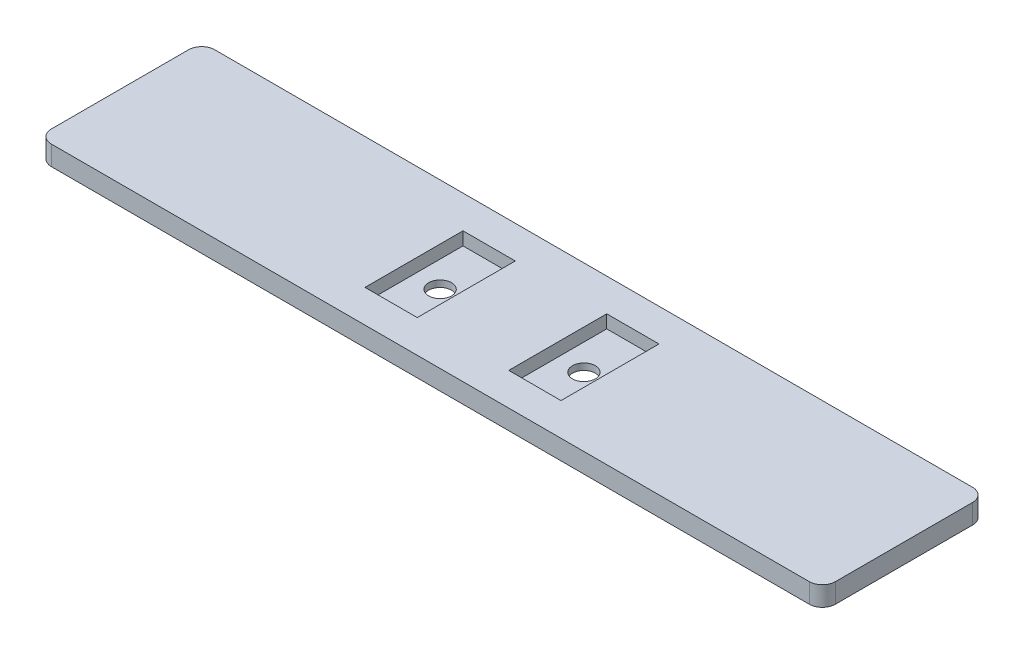
ISO-10303-21;
HEADER;
FILE_DESCRIPTION(('STEP AP214'),'2;1');
FILE_NAME('part.step','',(''),(''),'','','');
FILE_SCHEMA(('AUTOMOTIVE_DESIGN { 1 0 10303 214 1 1 1 1 }'));
ENDSEC;
DATA;
#1=APPLICATION_CONTEXT('core data for automotive mechanical design processes');
#2=APPLICATION_PROTOCOL_DEFINITION('international standard','automotive_design',2000,#1);
#3=PRODUCT_CONTEXT('',#1,'mechanical');
#4=PRODUCT('Part','Part','',(#3));
#5=PRODUCT_RELATED_PRODUCT_CATEGORY('part','',(#4));
#6=PRODUCT_DEFINITION_FORMATION('','',#4);
#7=PRODUCT_DEFINITION_CONTEXT('part definition',#1,'design');
#8=PRODUCT_DEFINITION('design','',#6,#7);
#9=PRODUCT_DEFINITION_SHAPE('','',#8);
#10=(LENGTH_UNIT() NAMED_UNIT(*) SI_UNIT(.MILLI.,.METRE.));
#11=(NAMED_UNIT(*) PLANE_ANGLE_UNIT() SI_UNIT($,.RADIAN.));
#12=(NAMED_UNIT(*) SI_UNIT($,.STERADIAN.) SOLID_ANGLE_UNIT());
#13=UNCERTAINTY_MEASURE_WITH_UNIT(LENGTH_MEASURE(1.E-05),#10,'distance_accuracy_value','');
#14=(GEOMETRIC_REPRESENTATION_CONTEXT(3) GLOBAL_UNCERTAINTY_ASSIGNED_CONTEXT((#13)) GLOBAL_UNIT_ASSIGNED_CONTEXT((#10,
#11,#12)) REPRESENTATION_CONTEXT('',''));
#15=CARTESIAN_POINT('',(0.,0.,0.));
#16=DIRECTION('',(0.,0.,1.));
#17=DIRECTION('',(1.,0.,0.));
#18=AXIS2_PLACEMENT_3D('',#15,#16,#17);
#19=CARTESIAN_POINT('',(-58.,3.,-10.5));
#20=DIRECTION('',(0.,1.,0.));
#21=DIRECTION('',(0.,0.,1.));
#22=AXIS2_PLACEMENT_3D('',#19,#20,#21);
#23=CYLINDRICAL_SURFACE('',#22,2.);
#24=DIRECTION('',(0.,1.,0.));
#25=VECTOR('',#24,1.);
#26=CARTESIAN_POINT('',(-58.,3.,-12.5));
#27=LINE('',#26,#25);
#28=CARTESIAN_POINT('',(-58.,0.,-12.5));
#29=VERTEX_POINT('',#28);
#30=CARTESIAN_POINT('',(-58.,3.,-12.5));
#31=VERTEX_POINT('',#30);
#32=EDGE_CURVE('E278',#29,#31,#27,.T.);
#33=ORIENTED_EDGE('',*,*,#32,.F.);
#34=CARTESIAN_POINT('',(-58.,0.,-10.5));
#35=DIRECTION('',(0.,1.,0.));
#36=DIRECTION('',(0.,0.,1.));
#37=AXIS2_PLACEMENT_3D('',#34,#35,#36);
#38=CIRCLE('',#37,2.);
#39=CARTESIAN_POINT('',(-60.,0.,-10.5));
#40=VERTEX_POINT('',#39);
#41=EDGE_CURVE('E40',#40,#29,#38,.F.);
#42=ORIENTED_EDGE('',*,*,#41,.F.);
#43=DIRECTION('',(0.,1.,0.));
#44=VECTOR('',#43,1.);
#45=CARTESIAN_POINT('',(-60.,3.,-10.5));
#46=LINE('',#45,#44);
#47=CARTESIAN_POINT('',(-60.,3.,-10.5));
#48=VERTEX_POINT('',#47);
#49=EDGE_CURVE('E281',#48,#40,#46,.F.);
#50=ORIENTED_EDGE('',*,*,#49,.F.);
#51=CARTESIAN_POINT('',(-58.,3.,-10.5));
#52=DIRECTION('',(0.,1.,0.));
#53=DIRECTION('',(0.,0.,1.));
#54=AXIS2_PLACEMENT_3D('',#51,#52,#53);
#55=CIRCLE('',#54,2.);
#56=EDGE_CURVE('E11',#31,#48,#55,.T.);
#57=ORIENTED_EDGE('',*,*,#56,.F.);
#58=EDGE_LOOP('',(#33,#42,#50,#57));
#59=FACE_BOUND('',#58,.T.);
#60=ADVANCED_FACE('F33',(#59),#23,.T.);
#61=CARTESIAN_POINT('',(58.,3.,-10.5));
#62=DIRECTION('',(0.,1.,0.));
#63=DIRECTION('',(0.,0.,1.));
#64=AXIS2_PLACEMENT_3D('',#61,#62,#63);
#65=CYLINDRICAL_SURFACE('',#64,2.);
#66=DIRECTION('',(0.,1.,0.));
#67=VECTOR('',#66,1.);
#68=CARTESIAN_POINT('',(60.,3.,-10.5));
#69=LINE('',#68,#67);
#70=CARTESIAN_POINT('',(60.,0.,-10.5));
#71=VERTEX_POINT('',#70);
#72=CARTESIAN_POINT('',(60.,3.,-10.5));
#73=VERTEX_POINT('',#72);
#74=EDGE_CURVE('E268',#71,#73,#69,.T.);
#75=ORIENTED_EDGE('',*,*,#74,.F.);
#76=CARTESIAN_POINT('',(58.,0.,-10.5));
#77=DIRECTION('',(0.,1.,0.));
#78=DIRECTION('',(0.,0.,1.));
#79=AXIS2_PLACEMENT_3D('',#76,#77,#78);
#80=CIRCLE('',#79,2.);
#81=CARTESIAN_POINT('',(58.,0.,-12.5));
#82=VERTEX_POINT('',#81);
#83=EDGE_CURVE('E274',#82,#71,#80,.F.);
#84=ORIENTED_EDGE('',*,*,#83,.F.);
#85=DIRECTION('',(0.,1.,0.));
#86=VECTOR('',#85,1.);
#87=CARTESIAN_POINT('',(58.,3.,-12.5));
#88=LINE('',#87,#86);
#89=CARTESIAN_POINT('',(58.,3.,-12.5));
#90=VERTEX_POINT('',#89);
#91=EDGE_CURVE('E271',#90,#82,#88,.F.);
#92=ORIENTED_EDGE('',*,*,#91,.F.);
#93=CARTESIAN_POINT('',(58.,3.,-10.5));
#94=DIRECTION('',(0.,1.,0.));
#95=DIRECTION('',(0.,0.,1.));
#96=AXIS2_PLACEMENT_3D('',#93,#94,#95);
#97=CIRCLE('',#96,2.);
#98=EDGE_CURVE('E276',#73,#90,#97,.T.);
#99=ORIENTED_EDGE('',*,*,#98,.F.);
#100=EDGE_LOOP('',(#75,#84,#92,#99));
#101=FACE_BOUND('',#100,.T.);
#102=ADVANCED_FACE('F292',(#101),#65,.T.);
#103=CARTESIAN_POINT('',(58.,3.,10.5));
#104=DIRECTION('',(0.,1.,0.));
#105=DIRECTION('',(0.,0.,1.));
#106=AXIS2_PLACEMENT_3D('',#103,#104,#105);
#107=CYLINDRICAL_SURFACE('',#106,2.);
#108=DIRECTION('',(0.,1.,0.));
#109=VECTOR('',#108,1.);
#110=CARTESIAN_POINT('',(58.,3.,12.5));
#111=LINE('',#110,#109);
#112=CARTESIAN_POINT('',(58.,0.,12.5));
#113=VERTEX_POINT('',#112);
#114=CARTESIAN_POINT('',(58.,3.,12.5));
#115=VERTEX_POINT('',#114);
#116=EDGE_CURVE('E258',#113,#115,#111,.T.);
#117=ORIENTED_EDGE('',*,*,#116,.F.);
#118=CARTESIAN_POINT('',(58.,0.,10.5));
#119=DIRECTION('',(0.,1.,0.));
#120=DIRECTION('',(0.,0.,1.));
#121=AXIS2_PLACEMENT_3D('',#118,#119,#120);
#122=CIRCLE('',#121,2.);
#123=CARTESIAN_POINT('',(60.,0.,10.5));
#124=VERTEX_POINT('',#123);
#125=EDGE_CURVE('E264',#124,#113,#122,.F.);
#126=ORIENTED_EDGE('',*,*,#125,.F.);
#127=DIRECTION('',(0.,1.,0.));
#128=VECTOR('',#127,1.);
#129=CARTESIAN_POINT('',(60.,3.,10.5));
#130=LINE('',#129,#128);
#131=CARTESIAN_POINT('',(60.,3.,10.5));
#132=VERTEX_POINT('',#131);
#133=EDGE_CURVE('E261',#132,#124,#130,.F.);
#134=ORIENTED_EDGE('',*,*,#133,.F.);
#135=CARTESIAN_POINT('',(58.,3.,10.5));
#136=DIRECTION('',(0.,1.,0.));
#137=DIRECTION('',(0.,0.,1.));
#138=AXIS2_PLACEMENT_3D('',#135,#136,#137);
#139=CIRCLE('',#138,2.);
#140=EDGE_CURVE('E266',#115,#132,#139,.T.);
#141=ORIENTED_EDGE('',*,*,#140,.F.);
#142=EDGE_LOOP('',(#117,#126,#134,#141));
#143=FACE_BOUND('',#142,.T.);
#144=ADVANCED_FACE('F301',(#143),#107,.T.);
#145=CARTESIAN_POINT('',(-58.,3.,10.5));
#146=DIRECTION('',(0.,1.,0.));
#147=DIRECTION('',(0.,0.,1.));
#148=AXIS2_PLACEMENT_3D('',#145,#146,#147);
#149=CYLINDRICAL_SURFACE('',#148,2.);
#150=DIRECTION('',(0.,1.,0.));
#151=VECTOR('',#150,1.);
#152=CARTESIAN_POINT('',(-60.,3.,10.5));
#153=LINE('',#152,#151);
#154=CARTESIAN_POINT('',(-60.,0.,10.5));
#155=VERTEX_POINT('',#154);
#156=CARTESIAN_POINT('',(-60.,3.,10.5));
#157=VERTEX_POINT('',#156);
#158=EDGE_CURVE('E232',#155,#157,#153,.T.);
#159=ORIENTED_EDGE('',*,*,#158,.F.);
#160=CARTESIAN_POINT('',(-58.,0.,10.5));
#161=DIRECTION('',(0.,1.,0.));
#162=DIRECTION('',(0.,0.,1.));
#163=AXIS2_PLACEMENT_3D('',#160,#161,#162);
#164=CIRCLE('',#163,2.);
#165=CARTESIAN_POINT('',(-58.,0.,12.5));
#166=VERTEX_POINT('',#165);
#167=EDGE_CURVE('E253',#166,#155,#164,.F.);
#168=ORIENTED_EDGE('',*,*,#167,.F.);
#169=DIRECTION('',(0.,1.,0.));
#170=VECTOR('',#169,1.);
#171=CARTESIAN_POINT('',(-58.,3.,12.5));
#172=LINE('',#171,#170);
#173=CARTESIAN_POINT('',(-58.,3.,12.5));
#174=VERTEX_POINT('',#173);
#175=EDGE_CURVE('E250',#174,#166,#172,.F.);
#176=ORIENTED_EDGE('',*,*,#175,.F.);
#177=CARTESIAN_POINT('',(-58.,3.,10.5));
#178=DIRECTION('',(0.,1.,0.));
#179=DIRECTION('',(0.,0.,1.));
#180=AXIS2_PLACEMENT_3D('',#177,#178,#179);
#181=CIRCLE('',#180,2.);
#182=EDGE_CURVE('E256',#157,#174,#181,.T.);
#183=ORIENTED_EDGE('',*,*,#182,.F.);
#184=EDGE_LOOP('',(#159,#168,#176,#183));
#185=FACE_BOUND('',#184,.T.);
#186=ADVANCED_FACE('F309',(#185),#149,.T.);
#187=CARTESIAN_POINT('',(-60.,3.,12.5));
#188=DIRECTION('',(1.,0.,0.));
#189=DIRECTION('',(0.,0.,-1.));
#190=AXIS2_PLACEMENT_3D('',#187,#188,#189);
#191=PLANE('',#190);
#192=DIRECTION('',(0.,0.,1.));
#193=VECTOR('',#192,1.);
#194=CARTESIAN_POINT('',(-60.,3.,12.5));
#195=LINE('',#194,#193);
#196=EDGE_CURVE('E221',#48,#157,#195,.T.);
#197=ORIENTED_EDGE('',*,*,#196,.F.);
#198=ORIENTED_EDGE('',*,*,#49,.T.);
#199=DIRECTION('',(0.,0.,1.));
#200=VECTOR('',#199,1.);
#201=CARTESIAN_POINT('',(-60.,0.,12.5));
#202=LINE('',#201,#200);
#203=EDGE_CURVE('E214',#40,#155,#202,.T.);
#204=ORIENTED_EDGE('',*,*,#203,.T.);
#205=ORIENTED_EDGE('',*,*,#158,.T.);
#206=EDGE_LOOP('',(#197,#198,#204,#205));
#207=FACE_BOUND('',#206,.T.);
#208=ADVANCED_FACE('F312',(#207),#191,.F.);
#209=CARTESIAN_POINT('',(60.,3.,12.5));
#210=DIRECTION('',(0.,0.,-1.));
#211=DIRECTION('',(-1.,0.,0.));
#212=AXIS2_PLACEMENT_3D('',#209,#210,#211);
#213=PLANE('',#212);
#214=DIRECTION('',(1.,0.,0.));
#215=VECTOR('',#214,1.);
#216=CARTESIAN_POINT('',(60.,0.,12.5));
#217=LINE('',#216,#215);
#218=EDGE_CURVE('E234',#166,#113,#217,.T.);
#219=ORIENTED_EDGE('',*,*,#218,.T.);
#220=ORIENTED_EDGE('',*,*,#116,.T.);
#221=DIRECTION('',(1.,0.,0.));
#222=VECTOR('',#221,1.);
#223=CARTESIAN_POINT('',(60.,3.,12.5));
#224=LINE('',#223,#222);
#225=EDGE_CURVE('E223',#174,#115,#224,.T.);
#226=ORIENTED_EDGE('',*,*,#225,.F.);
#227=ORIENTED_EDGE('',*,*,#175,.T.);
#228=EDGE_LOOP('',(#219,#220,#226,#227));
#229=FACE_BOUND('',#228,.T.);
#230=ADVANCED_FACE('F304',(#229),#213,.F.);
#231=CARTESIAN_POINT('',(60.,3.,12.5));
#232=DIRECTION('',(-1.,0.,0.));
#233=DIRECTION('',(0.,0.,1.));
#234=AXIS2_PLACEMENT_3D('',#231,#232,#233);
#235=PLANE('',#234);
#236=DIRECTION('',(0.,0.,-1.));
#237=VECTOR('',#236,1.);
#238=CARTESIAN_POINT('',(60.,0.,12.5));
#239=LINE('',#238,#237);
#240=EDGE_CURVE('E237',#124,#71,#239,.T.);
#241=ORIENTED_EDGE('',*,*,#240,.T.);
#242=ORIENTED_EDGE('',*,*,#74,.T.);
#243=DIRECTION('',(0.,0.,-1.));
#244=VECTOR('',#243,1.);
#245=CARTESIAN_POINT('',(60.,3.,12.5));
#246=LINE('',#245,#244);
#247=EDGE_CURVE('E227',#132,#73,#246,.T.);
#248=ORIENTED_EDGE('',*,*,#247,.F.);
#249=ORIENTED_EDGE('',*,*,#133,.T.);
#250=EDGE_LOOP('',(#241,#242,#248,#249));
#251=FACE_BOUND('',#250,.T.);
#252=ADVANCED_FACE('F297',(#251),#235,.F.);
#253=CARTESIAN_POINT('',(60.,3.,-12.5));
#254=DIRECTION('',(0.,0.,1.));
#255=DIRECTION('',(1.,0.,0.));
#256=AXIS2_PLACEMENT_3D('',#253,#254,#255);
#257=PLANE('',#256);
#258=DIRECTION('',(-1.,0.,0.));
#259=VECTOR('',#258,1.);
#260=CARTESIAN_POINT('',(60.,0.,-12.5));
#261=LINE('',#260,#259);
#262=EDGE_CURVE('E224',#82,#29,#261,.T.);
#263=ORIENTED_EDGE('',*,*,#262,.T.);
#264=ORIENTED_EDGE('',*,*,#32,.T.);
#265=DIRECTION('',(-1.,0.,0.));
#266=VECTOR('',#265,1.);
#267=CARTESIAN_POINT('',(60.,3.,-12.5));
#268=LINE('',#267,#266);
#269=EDGE_CURVE('E230',#90,#31,#268,.T.);
#270=ORIENTED_EDGE('',*,*,#269,.F.);
#271=ORIENTED_EDGE('',*,*,#91,.T.);
#272=EDGE_LOOP('',(#263,#264,#270,#271));
#273=FACE_BOUND('',#272,.T.);
#274=ADVANCED_FACE('F288',(#273),#257,.F.);
#275=CARTESIAN_POINT('',(0.,3.,0.));
#276=DIRECTION('',(0.,1.,0.));
#277=DIRECTION('',(0.,0.,1.));
#278=AXIS2_PLACEMENT_3D('',#275,#276,#277);
#279=PLANE('',#278);
#280=DIRECTION('',(0.,0.,-1.));
#281=VECTOR('',#280,1.);
#282=CARTESIAN_POINT('',(15.0000000000001,3.,-7.49999999999993));
#283=LINE('',#282,#281);
#284=CARTESIAN_POINT('',(15.,3.,7.50000000000007));
#285=VERTEX_POINT('',#284);
#286=CARTESIAN_POINT('',(15.0000000000001,3.,-7.49999999999993));
#287=VERTEX_POINT('',#286);
#288=EDGE_CURVE('E149',#285,#287,#283,.T.);
#289=ORIENTED_EDGE('',*,*,#288,.F.);
#290=DIRECTION('',(1.,0.,0.));
#291=VECTOR('',#290,1.);
#292=CARTESIAN_POINT('',(15.,3.,7.50000000000007));
#293=LINE('',#292,#291);
#294=CARTESIAN_POINT('',(6.99999999999999,3.,7.50000000000003));
#295=VERTEX_POINT('',#294);
#296=EDGE_CURVE('E166',#295,#285,#293,.T.);
#297=ORIENTED_EDGE('',*,*,#296,.F.);
#298=DIRECTION('',(0.,0.,1.));
#299=VECTOR('',#298,1.);
#300=CARTESIAN_POINT('',(7.00000000000007,3.,-7.49999999999997));
#301=LINE('',#300,#299);
#302=CARTESIAN_POINT('',(7.00000000000007,3.,-7.49999999999997));
#303=VERTEX_POINT('',#302);
#304=EDGE_CURVE('E169',#303,#295,#301,.T.);
#305=ORIENTED_EDGE('',*,*,#304,.F.);
#306=DIRECTION('',(-1.,0.,0.));
#307=VECTOR('',#306,1.);
#308=CARTESIAN_POINT('',(15.0000000000001,3.,-7.49999999999993));
#309=LINE('',#308,#307);
#310=EDGE_CURVE('E178',#287,#303,#309,.T.);
#311=ORIENTED_EDGE('',*,*,#310,.F.);
#312=EDGE_LOOP('',(#289,#297,#305,#311));
#313=FACE_BOUND('',#312,.T.);
#314=DIRECTION('',(0.,0.,-1.));
#315=VECTOR('',#314,1.);
#316=CARTESIAN_POINT('',(-7.,3.,-7.5));
#317=LINE('',#316,#315);
#318=CARTESIAN_POINT('',(-7.,3.,7.5));
#319=VERTEX_POINT('',#318);
#320=CARTESIAN_POINT('',(-7.,3.,-7.5));
#321=VERTEX_POINT('',#320);
#322=EDGE_CURVE('E185',#319,#321,#317,.T.);
#323=ORIENTED_EDGE('',*,*,#322,.F.);
#324=DIRECTION('',(1.,0.,0.));
#325=VECTOR('',#324,1.);
#326=CARTESIAN_POINT('',(-15.,3.,7.5));
#327=LINE('',#326,#325);
#328=CARTESIAN_POINT('',(-15.,3.,7.5));
#329=VERTEX_POINT('',#328);
#330=EDGE_CURVE('E193',#329,#319,#327,.T.);
#331=ORIENTED_EDGE('',*,*,#330,.F.);
#332=DIRECTION('',(0.,0.,1.));
#333=VECTOR('',#332,1.);
#334=CARTESIAN_POINT('',(-15.,3.,-7.5));
#335=LINE('',#334,#333);
#336=CARTESIAN_POINT('',(-15.,3.,-7.5));
#337=VERTEX_POINT('',#336);
#338=EDGE_CURVE('E207',#337,#329,#335,.T.);
#339=ORIENTED_EDGE('',*,*,#338,.F.);
#340=DIRECTION('',(-1.,0.,0.));
#341=VECTOR('',#340,1.);
#342=CARTESIAN_POINT('',(-15.,3.,-7.5));
#343=LINE('',#342,#341);
#344=EDGE_CURVE('E204',#321,#337,#343,.T.);
#345=ORIENTED_EDGE('',*,*,#344,.F.);
#346=EDGE_LOOP('',(#323,#331,#339,#345));
#347=FACE_BOUND('',#346,.T.);
#348=ORIENTED_EDGE('',*,*,#269,.T.);
#349=ORIENTED_EDGE('',*,*,#56,.T.);
#350=ORIENTED_EDGE('',*,*,#196,.T.);
#351=ORIENTED_EDGE('',*,*,#182,.T.);
#352=ORIENTED_EDGE('',*,*,#225,.T.);
#353=ORIENTED_EDGE('',*,*,#140,.T.);
#354=ORIENTED_EDGE('',*,*,#247,.T.);
#355=ORIENTED_EDGE('',*,*,#98,.T.);
#356=EDGE_LOOP('',(#348,#349,#350,#351,#352,#353,#354,#355));
#357=FACE_BOUND('',#356,.T.);
#358=ADVANCED_FACE('F313',(#313,#347,#357),#279,.T.);
#359=CARTESIAN_POINT('',(0.,0.,0.));
#360=DIRECTION('',(0.,1.,0.));
#361=DIRECTION('',(0.,0.,1.));
#362=AXIS2_PLACEMENT_3D('',#359,#360,#361);
#363=PLANE('',#362);
#364=CARTESIAN_POINT('',(11.,0.,0.));
#365=DIRECTION('',(0.,1.,0.));
#366=DIRECTION('',(0.,0.,-1.));
#367=AXIS2_PLACEMENT_3D('',#364,#365,#366);
#368=CIRCLE('',#367,1.75);
#369=CARTESIAN_POINT('',(11.,0.,-1.74999999999997));
#370=VERTEX_POINT('',#369);
#371=EDGE_CURVE('E247',#370,#370,#368,.T.);
#372=ORIENTED_EDGE('',*,*,#371,.T.);
#373=EDGE_LOOP('',(#372));
#374=FACE_BOUND('',#373,.T.);
#375=CARTESIAN_POINT('',(-11.,0.,0.));
#376=DIRECTION('',(0.,1.,0.));
#377=DIRECTION('',(0.,0.,1.));
#378=AXIS2_PLACEMENT_3D('',#375,#376,#377);
#379=CIRCLE('',#378,1.75);
#380=CARTESIAN_POINT('',(-11.,0.,1.75));
#381=VERTEX_POINT('',#380);
#382=EDGE_CURVE('E172',#381,#381,#379,.T.);
#383=ORIENTED_EDGE('',*,*,#382,.T.);
#384=EDGE_LOOP('',(#383));
#385=FACE_BOUND('',#384,.T.);
#386=ORIENTED_EDGE('',*,*,#203,.F.);
#387=ORIENTED_EDGE('',*,*,#41,.T.);
#388=ORIENTED_EDGE('',*,*,#262,.F.);
#389=ORIENTED_EDGE('',*,*,#83,.T.);
#390=ORIENTED_EDGE('',*,*,#240,.F.);
#391=ORIENTED_EDGE('',*,*,#125,.T.);
#392=ORIENTED_EDGE('',*,*,#218,.F.);
#393=ORIENTED_EDGE('',*,*,#167,.T.);
#394=EDGE_LOOP('',(#386,#387,#388,#389,#390,#391,#392,#393));
#395=FACE_BOUND('',#394,.T.);
#396=ADVANCED_FACE('F285',(#374,#385,#395),#363,.F.);
#397=CARTESIAN_POINT('',(-7.,1.,-7.5));
#398=DIRECTION('',(1.,0.,0.));
#399=DIRECTION('',(0.,0.,-1.));
#400=AXIS2_PLACEMENT_3D('',#397,#398,#399);
#401=PLANE('',#400);
#402=ORIENTED_EDGE('',*,*,#322,.T.);
#403=DIRECTION('',(0.,1.,0.));
#404=VECTOR('',#403,1.);
#405=CARTESIAN_POINT('',(-7.,1.,-7.5));
#406=LINE('',#405,#404);
#407=CARTESIAN_POINT('',(-7.,1.,-7.5));
#408=VERTEX_POINT('',#407);
#409=EDGE_CURVE('E202',#408,#321,#406,.T.);
#410=ORIENTED_EDGE('',*,*,#409,.F.);
#411=DIRECTION('',(0.,0.,-1.));
#412=VECTOR('',#411,1.);
#413=CARTESIAN_POINT('',(-7.,1.,-7.5));
#414=LINE('',#413,#412);
#415=CARTESIAN_POINT('',(-7.,1.,7.5));
#416=VERTEX_POINT('',#415);
#417=EDGE_CURVE('E189',#416,#408,#414,.T.);
#418=ORIENTED_EDGE('',*,*,#417,.F.);
#419=DIRECTION('',(0.,1.,0.));
#420=VECTOR('',#419,1.);
#421=CARTESIAN_POINT('',(-7.,1.,7.5));
#422=LINE('',#421,#420);
#423=EDGE_CURVE('E212',#416,#319,#422,.T.);
#424=ORIENTED_EDGE('',*,*,#423,.T.);
#425=EDGE_LOOP('',(#402,#410,#418,#424));
#426=FACE_BOUND('',#425,.T.);
#427=ADVANCED_FACE('F321',(#426),#401,.F.);
#428=CARTESIAN_POINT('',(-15.,1.,7.5));
#429=DIRECTION('',(0.,0.,1.));
#430=DIRECTION('',(1.,0.,0.));
#431=AXIS2_PLACEMENT_3D('',#428,#429,#430);
#432=PLANE('',#431);
#433=ORIENTED_EDGE('',*,*,#330,.T.);
#434=ORIENTED_EDGE('',*,*,#423,.F.);
#435=DIRECTION('',(1.,0.,0.));
#436=VECTOR('',#435,1.);
#437=CARTESIAN_POINT('',(-15.,1.,7.5));
#438=LINE('',#437,#436);
#439=CARTESIAN_POINT('',(-15.,1.,7.5));
#440=VERTEX_POINT('',#439);
#441=EDGE_CURVE('E199',#440,#416,#438,.T.);
#442=ORIENTED_EDGE('',*,*,#441,.F.);
#443=DIRECTION('',(0.,1.,0.));
#444=VECTOR('',#443,1.);
#445=CARTESIAN_POINT('',(-15.,1.,7.5));
#446=LINE('',#445,#444);
#447=EDGE_CURVE('E215',#440,#329,#446,.T.);
#448=ORIENTED_EDGE('',*,*,#447,.T.);
#449=EDGE_LOOP('',(#433,#434,#442,#448));
#450=FACE_BOUND('',#449,.T.);
#451=ADVANCED_FACE('F373',(#450),#432,.F.);
#452=CARTESIAN_POINT('',(-15.,1.,-7.5));
#453=DIRECTION('',(-1.,0.,0.));
#454=DIRECTION('',(0.,0.,1.));
#455=AXIS2_PLACEMENT_3D('',#452,#453,#454);
#456=PLANE('',#455);
#457=ORIENTED_EDGE('',*,*,#338,.T.);
#458=ORIENTED_EDGE('',*,*,#447,.F.);
#459=DIRECTION('',(0.,0.,1.));
#460=VECTOR('',#459,1.);
#461=CARTESIAN_POINT('',(-15.,1.,-7.5));
#462=LINE('',#461,#460);
#463=CARTESIAN_POINT('',(-15.,1.,-7.5));
#464=VERTEX_POINT('',#463);
#465=EDGE_CURVE('E196',#464,#440,#462,.T.);
#466=ORIENTED_EDGE('',*,*,#465,.F.);
#467=DIRECTION('',(0.,1.,0.));
#468=VECTOR('',#467,1.);
#469=CARTESIAN_POINT('',(-15.,1.,-7.5));
#470=LINE('',#469,#468);
#471=EDGE_CURVE('E217',#464,#337,#470,.T.);
#472=ORIENTED_EDGE('',*,*,#471,.T.);
#473=EDGE_LOOP('',(#457,#458,#466,#472));
#474=FACE_BOUND('',#473,.T.);
#475=ADVANCED_FACE('F379',(#474),#456,.F.);
#476=CARTESIAN_POINT('',(-15.,1.,-7.5));
#477=DIRECTION('',(0.,0.,-1.));
#478=DIRECTION('',(-1.,0.,0.));
#479=AXIS2_PLACEMENT_3D('',#476,#477,#478);
#480=PLANE('',#479);
#481=ORIENTED_EDGE('',*,*,#344,.T.);
#482=ORIENTED_EDGE('',*,*,#471,.F.);
#483=DIRECTION('',(-1.,0.,0.));
#484=VECTOR('',#483,1.);
#485=CARTESIAN_POINT('',(-15.,1.,-7.5));
#486=LINE('',#485,#484);
#487=EDGE_CURVE('E192',#408,#464,#486,.T.);
#488=ORIENTED_EDGE('',*,*,#487,.F.);
#489=ORIENTED_EDGE('',*,*,#409,.T.);
#490=EDGE_LOOP('',(#481,#482,#488,#489));
#491=FACE_BOUND('',#490,.T.);
#492=ADVANCED_FACE('F387',(#491),#480,.F.);
#493=CARTESIAN_POINT('',(0.,1.,0.));
#494=DIRECTION('',(0.,1.,0.));
#495=DIRECTION('',(0.,0.,1.));
#496=AXIS2_PLACEMENT_3D('',#493,#494,#495);
#497=PLANE('',#496);
#498=CARTESIAN_POINT('',(-11.,1.,0.));
#499=DIRECTION('',(0.,1.,0.));
#500=DIRECTION('',(0.,0.,1.));
#501=AXIS2_PLACEMENT_3D('',#498,#499,#500);
#502=CIRCLE('',#501,1.75);
#503=CARTESIAN_POINT('',(-11.,1.,1.75));
#504=VERTEX_POINT('',#503);
#505=EDGE_CURVE('E179',#504,#504,#502,.T.);
#506=ORIENTED_EDGE('',*,*,#505,.F.);
#507=EDGE_LOOP('',(#506));
#508=FACE_BOUND('',#507,.T.);
#509=ORIENTED_EDGE('',*,*,#417,.T.);
#510=ORIENTED_EDGE('',*,*,#487,.T.);
#511=ORIENTED_EDGE('',*,*,#465,.T.);
#512=ORIENTED_EDGE('',*,*,#441,.T.);
#513=EDGE_LOOP('',(#509,#510,#511,#512));
#514=FACE_BOUND('',#513,.T.);
#515=ADVANCED_FACE('F395',(#508,#514),#497,.T.);
#516=CARTESIAN_POINT('',(15.0000000000001,1.,-7.49999999999993));
#517=DIRECTION('',(1.,0.,0.));
#518=DIRECTION('',(0.,0.,-1.));
#519=AXIS2_PLACEMENT_3D('',#516,#517,#518);
#520=PLANE('',#519);
#521=ORIENTED_EDGE('',*,*,#288,.T.);
#522=DIRECTION('',(0.,1.,0.));
#523=VECTOR('',#522,1.);
#524=CARTESIAN_POINT('',(15.0000000000001,1.,-7.49999999999993));
#525=LINE('',#524,#523);
#526=CARTESIAN_POINT('',(15.0000000000001,1.,-7.49999999999993));
#527=VERTEX_POINT('',#526);
#528=EDGE_CURVE('E142',#527,#287,#525,.T.);
#529=ORIENTED_EDGE('',*,*,#528,.F.);
#530=DIRECTION('',(0.,0.,-1.));
#531=VECTOR('',#530,1.);
#532=CARTESIAN_POINT('',(15.0000000000001,1.,-7.49999999999993));
#533=LINE('',#532,#531);
#534=CARTESIAN_POINT('',(15.,1.,7.50000000000007));
#535=VERTEX_POINT('',#534);
#536=EDGE_CURVE('E146',#535,#527,#533,.T.);
#537=ORIENTED_EDGE('',*,*,#536,.F.);
#538=DIRECTION('',(0.,1.,0.));
#539=VECTOR('',#538,1.);
#540=CARTESIAN_POINT('',(15.,1.,7.50000000000007));
#541=LINE('',#540,#539);
#542=EDGE_CURVE('E183',#535,#285,#541,.T.);
#543=ORIENTED_EDGE('',*,*,#542,.T.);
#544=EDGE_LOOP('',(#521,#529,#537,#543));
#545=FACE_BOUND('',#544,.T.);
#546=ADVANCED_FACE('F144',(#545),#520,.F.);
#547=CARTESIAN_POINT('',(15.,1.,7.50000000000007));
#548=DIRECTION('',(0.,0.,1.));
#549=DIRECTION('',(1.,0.,0.));
#550=AXIS2_PLACEMENT_3D('',#547,#548,#549);
#551=PLANE('',#550);
#552=ORIENTED_EDGE('',*,*,#296,.T.);
#553=ORIENTED_EDGE('',*,*,#542,.F.);
#554=DIRECTION('',(1.,0.,0.));
#555=VECTOR('',#554,1.);
#556=CARTESIAN_POINT('',(15.,1.,7.50000000000007));
#557=LINE('',#556,#555);
#558=CARTESIAN_POINT('',(6.99999999999999,1.,7.50000000000003));
#559=VERTEX_POINT('',#558);
#560=EDGE_CURVE('E154',#559,#535,#557,.T.);
#561=ORIENTED_EDGE('',*,*,#560,.F.);
#562=DIRECTION('',(0.,1.,0.));
#563=VECTOR('',#562,1.);
#564=CARTESIAN_POINT('',(6.99999999999999,1.,7.50000000000003));
#565=LINE('',#564,#563);
#566=EDGE_CURVE('E186',#559,#295,#565,.T.);
#567=ORIENTED_EDGE('',*,*,#566,.T.);
#568=EDGE_LOOP('',(#552,#553,#561,#567));
#569=FACE_BOUND('',#568,.T.);
#570=ADVANCED_FACE('F412',(#569),#551,.F.);
#571=CARTESIAN_POINT('',(7.00000000000007,1.,-7.49999999999997));
#572=DIRECTION('',(-1.,0.,0.));
#573=DIRECTION('',(0.,0.,1.));
#574=AXIS2_PLACEMENT_3D('',#571,#572,#573);
#575=PLANE('',#574);
#576=ORIENTED_EDGE('',*,*,#304,.T.);
#577=ORIENTED_EDGE('',*,*,#566,.F.);
#578=DIRECTION('',(0.,0.,1.));
#579=VECTOR('',#578,1.);
#580=CARTESIAN_POINT('',(7.00000000000007,1.,-7.49999999999997));
#581=LINE('',#580,#579);
#582=CARTESIAN_POINT('',(7.00000000000007,1.,-7.49999999999997));
#583=VERTEX_POINT('',#582);
#584=EDGE_CURVE('E162',#583,#559,#581,.T.);
#585=ORIENTED_EDGE('',*,*,#584,.F.);
#586=DIRECTION('',(0.,1.,0.));
#587=VECTOR('',#586,1.);
#588=CARTESIAN_POINT('',(7.00000000000007,1.,-7.49999999999997));
#589=LINE('',#588,#587);
#590=EDGE_CURVE('E153',#583,#303,#589,.T.);
#591=ORIENTED_EDGE('',*,*,#590,.T.);
#592=EDGE_LOOP('',(#576,#577,#585,#591));
#593=FACE_BOUND('',#592,.T.);
#594=ADVANCED_FACE('F419',(#593),#575,.F.);
#595=CARTESIAN_POINT('',(15.0000000000001,1.,-7.49999999999993));
#596=DIRECTION('',(0.,0.,-1.));
#597=DIRECTION('',(-1.,0.,0.));
#598=AXIS2_PLACEMENT_3D('',#595,#596,#597);
#599=PLANE('',#598);
#600=ORIENTED_EDGE('',*,*,#310,.T.);
#601=ORIENTED_EDGE('',*,*,#590,.F.);
#602=DIRECTION('',(-1.,0.,0.));
#603=VECTOR('',#602,1.);
#604=CARTESIAN_POINT('',(15.0000000000001,1.,-7.49999999999993));
#605=LINE('',#604,#603);
#606=EDGE_CURVE('E157',#527,#583,#605,.T.);
#607=ORIENTED_EDGE('',*,*,#606,.F.);
#608=ORIENTED_EDGE('',*,*,#528,.T.);
#609=EDGE_LOOP('',(#600,#601,#607,#608));
#610=FACE_BOUND('',#609,.T.);
#611=ADVANCED_FACE('F158',(#610),#599,.F.);
#612=CARTESIAN_POINT('',(0.,1.,0.));
#613=DIRECTION('',(0.,-1.,0.));
#614=DIRECTION('',(0.,0.,-1.));
#615=AXIS2_PLACEMENT_3D('',#612,#613,#614);
#616=PLANE('',#615);
#617=CARTESIAN_POINT('',(11.,1.,0.));
#618=DIRECTION('',(0.,-1.,0.));
#619=DIRECTION('',(0.,0.,-1.));
#620=AXIS2_PLACEMENT_3D('',#617,#618,#619);
#621=CIRCLE('',#620,1.75);
#622=CARTESIAN_POINT('',(11.,1.,-1.74999999999997));
#623=VERTEX_POINT('',#622);
#624=EDGE_CURVE('E244',#623,#623,#621,.T.);
#625=ORIENTED_EDGE('',*,*,#624,.T.);
#626=EDGE_LOOP('',(#625));
#627=FACE_BOUND('',#626,.T.);
#628=ORIENTED_EDGE('',*,*,#536,.T.);
#629=ORIENTED_EDGE('',*,*,#606,.T.);
#630=ORIENTED_EDGE('',*,*,#584,.T.);
#631=ORIENTED_EDGE('',*,*,#560,.T.);
#632=EDGE_LOOP('',(#628,#629,#630,#631));
#633=FACE_BOUND('',#632,.T.);
#634=ADVANCED_FACE('F164',(#627,#633),#616,.F.);
#635=CARTESIAN_POINT('',(-11.,0.,0.));
#636=DIRECTION('',(0.,1.,0.));
#637=DIRECTION('',(0.,0.,1.));
#638=AXIS2_PLACEMENT_3D('',#635,#636,#637);
#639=CYLINDRICAL_SURFACE('',#638,1.75);
#640=ORIENTED_EDGE('',*,*,#505,.T.);
#641=EDGE_LOOP('',(#640));
#642=FACE_BOUND('',#641,.T.);
#643=ORIENTED_EDGE('',*,*,#382,.F.);
#644=EDGE_LOOP('',(#643));
#645=FACE_BOUND('',#644,.T.);
#646=ADVANCED_FACE('F438',(#642,#645),#639,.F.);
#647=CARTESIAN_POINT('',(11.,0.,0.));
#648=DIRECTION('',(0.,1.,0.));
#649=DIRECTION('',(0.,0.,1.));
#650=AXIS2_PLACEMENT_3D('',#647,#648,#649);
#651=CYLINDRICAL_SURFACE('',#650,1.75);
#652=ORIENTED_EDGE('',*,*,#371,.F.);
#653=EDGE_LOOP('',(#652));
#654=FACE_BOUND('',#653,.T.);
#655=ORIENTED_EDGE('',*,*,#624,.F.);
#656=EDGE_LOOP('',(#655));
#657=FACE_BOUND('',#656,.T.);
#658=ADVANCED_FACE('F446',(#654,#657),#651,.F.);
#659=CLOSED_SHELL('',(#60,#102,#144,#186,#208,#230,#252,#274,#358,#396,#427,#451,#475,#492,#515,
#546,#570,#594,#611,#634,#646,#658));
#660=MANIFOLD_SOLID_BREP('B2',#659);
#661=ADVANCED_BREP_SHAPE_REPRESENTATION('',(#18,#660),#14);
#662=SHAPE_DEFINITION_REPRESENTATION(#9,#661);
ENDSEC;
END-ISO-10303-21;
